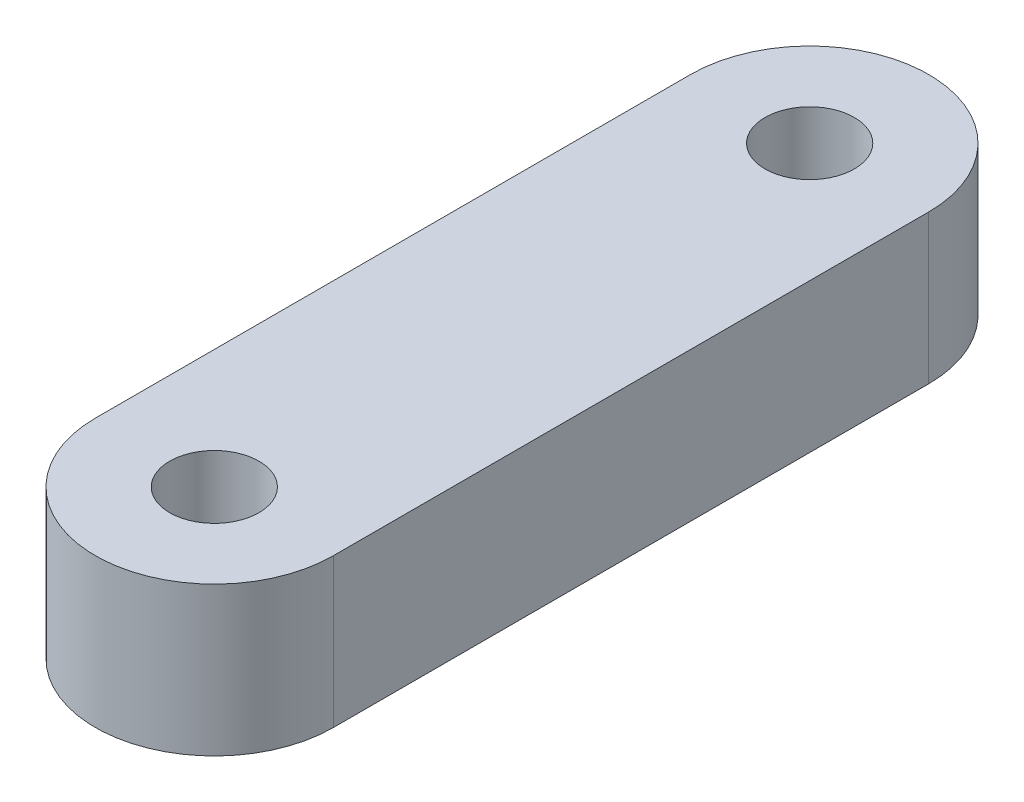
ISO-10303-21;
HEADER;
FILE_DESCRIPTION(('STEP AP214'),'2;1');
FILE_NAME('part.step','',(''),(''),'','','');
FILE_SCHEMA(('AUTOMOTIVE_DESIGN { 1 0 10303 214 1 1 1 1 }'));
ENDSEC;
DATA;
#1=APPLICATION_CONTEXT('core data for automotive mechanical design processes');
#2=APPLICATION_PROTOCOL_DEFINITION('international standard','automotive_design',2000,#1);
#3=PRODUCT_CONTEXT('',#1,'mechanical');
#4=PRODUCT('Part','Part','',(#3));
#5=PRODUCT_RELATED_PRODUCT_CATEGORY('part','',(#4));
#6=PRODUCT_DEFINITION_FORMATION('','',#4);
#7=PRODUCT_DEFINITION_CONTEXT('part definition',#1,'design');
#8=PRODUCT_DEFINITION('design','',#6,#7);
#9=PRODUCT_DEFINITION_SHAPE('','',#8);
#10=(LENGTH_UNIT() NAMED_UNIT(*) SI_UNIT(.MILLI.,.METRE.));
#11=(NAMED_UNIT(*) PLANE_ANGLE_UNIT() SI_UNIT($,.RADIAN.));
#12=(NAMED_UNIT(*) SI_UNIT($,.STERADIAN.) SOLID_ANGLE_UNIT());
#13=UNCERTAINTY_MEASURE_WITH_UNIT(LENGTH_MEASURE(1.E-05),#10,'distance_accuracy_value','');
#14=(GEOMETRIC_REPRESENTATION_CONTEXT(3) GLOBAL_UNCERTAINTY_ASSIGNED_CONTEXT((#13)) GLOBAL_UNIT_ASSIGNED_CONTEXT((#10,
#11,#12)) REPRESENTATION_CONTEXT('',''));
#15=CARTESIAN_POINT('',(0.,0.,0.));
#16=DIRECTION('',(0.,0.,1.));
#17=DIRECTION('',(1.,0.,0.));
#18=AXIS2_PLACEMENT_3D('',#15,#16,#17);
#19=CARTESIAN_POINT('',(-4.,5.,0.));
#20=DIRECTION('',(1.,0.,0.));
#21=DIRECTION('',(0.,0.,-1.));
#22=AXIS2_PLACEMENT_3D('',#19,#20,#21);
#23=PLANE('',#22);
#24=DIRECTION('',(0.,0.,1.));
#25=VECTOR('',#24,1.);
#26=CARTESIAN_POINT('',(-4.,0.,0.));
#27=LINE('',#26,#25);
#28=CARTESIAN_POINT('',(-4.,0.,-10.));
#29=VERTEX_POINT('',#28);
#30=CARTESIAN_POINT('',(-4.,0.,10.));
#31=VERTEX_POINT('',#30);
#32=EDGE_CURVE('E104',#29,#31,#27,.T.);
#33=ORIENTED_EDGE('',*,*,#32,.T.);
#34=DIRECTION('',(0.,-1.,0.));
#35=VECTOR('',#34,1.);
#36=CARTESIAN_POINT('',(-4.,5.,10.));
#37=LINE('',#36,#35);
#38=CARTESIAN_POINT('',(-4.,5.,10.));
#39=VERTEX_POINT('',#38);
#40=EDGE_CURVE('E11',#39,#31,#37,.T.);
#41=ORIENTED_EDGE('',*,*,#40,.F.);
#42=DIRECTION('',(0.,0.,1.));
#43=VECTOR('',#42,1.);
#44=CARTESIAN_POINT('',(-4.,5.,0.));
#45=LINE('',#44,#43);
#46=CARTESIAN_POINT('',(-4.,5.,-10.));
#47=VERTEX_POINT('',#46);
#48=EDGE_CURVE('E83',#47,#39,#45,.T.);
#49=ORIENTED_EDGE('',*,*,#48,.F.);
#50=DIRECTION('',(0.,-1.,0.));
#51=VECTOR('',#50,1.);
#52=CARTESIAN_POINT('',(-4.,5.,-10.));
#53=LINE('',#52,#51);
#54=EDGE_CURVE('E94',#47,#29,#53,.T.);
#55=ORIENTED_EDGE('',*,*,#54,.T.);
#56=EDGE_LOOP('',(#33,#41,#49,#55));
#57=FACE_BOUND('',#56,.T.);
#58=ADVANCED_FACE('F35',(#57),#23,.F.);
#59=CARTESIAN_POINT('',(0.,5.,10.));
#60=DIRECTION('',(0.,-1.,0.));
#61=DIRECTION('',(0.,0.,-1.));
#62=AXIS2_PLACEMENT_3D('',#59,#60,#61);
#63=CYLINDRICAL_SURFACE('',#62,4.);
#64=CARTESIAN_POINT('',(0.,0.,10.));
#65=DIRECTION('',(0.,1.,0.));
#66=DIRECTION('',(0.,0.,1.));
#67=AXIS2_PLACEMENT_3D('',#64,#65,#66);
#68=CIRCLE('',#67,4.);
#69=CARTESIAN_POINT('',(4.,0.,10.));
#70=VERTEX_POINT('',#69);
#71=EDGE_CURVE('E88',#31,#70,#68,.T.);
#72=ORIENTED_EDGE('',*,*,#71,.T.);
#73=DIRECTION('',(0.,-1.,0.));
#74=VECTOR('',#73,1.);
#75=CARTESIAN_POINT('',(4.,5.,10.));
#76=LINE('',#75,#74);
#77=CARTESIAN_POINT('',(4.,5.,10.));
#78=VERTEX_POINT('',#77);
#79=EDGE_CURVE('E44',#78,#70,#76,.T.);
#80=ORIENTED_EDGE('',*,*,#79,.F.);
#81=CARTESIAN_POINT('',(0.,5.,10.));
#82=DIRECTION('',(0.,1.,0.));
#83=DIRECTION('',(0.,0.,1.));
#84=AXIS2_PLACEMENT_3D('',#81,#82,#83);
#85=CIRCLE('',#84,4.);
#86=EDGE_CURVE('E78',#39,#78,#85,.T.);
#87=ORIENTED_EDGE('',*,*,#86,.F.);
#88=ORIENTED_EDGE('',*,*,#40,.T.);
#89=EDGE_LOOP('',(#72,#80,#87,#88));
#90=FACE_BOUND('',#89,.T.);
#91=ADVANCED_FACE('F87',(#90),#63,.T.);
#92=CARTESIAN_POINT('',(4.,5.,0.));
#93=DIRECTION('',(1.,0.,0.));
#94=DIRECTION('',(0.,0.,-1.));
#95=AXIS2_PLACEMENT_3D('',#92,#93,#94);
#96=PLANE('',#95);
#97=DIRECTION('',(0.,0.,1.));
#98=VECTOR('',#97,1.);
#99=CARTESIAN_POINT('',(4.,0.,0.));
#100=LINE('',#99,#98);
#101=CARTESIAN_POINT('',(4.,0.,-10.));
#102=VERTEX_POINT('',#101);
#103=EDGE_CURVE('E108',#102,#70,#100,.T.);
#104=ORIENTED_EDGE('',*,*,#103,.F.);
#105=DIRECTION('',(0.,-1.,0.));
#106=VECTOR('',#105,1.);
#107=CARTESIAN_POINT('',(4.,5.,-10.));
#108=LINE('',#107,#106);
#109=CARTESIAN_POINT('',(4.,5.,-10.));
#110=VERTEX_POINT('',#109);
#111=EDGE_CURVE('E68',#110,#102,#108,.T.);
#112=ORIENTED_EDGE('',*,*,#111,.F.);
#113=DIRECTION('',(0.,0.,1.));
#114=VECTOR('',#113,1.);
#115=CARTESIAN_POINT('',(4.,5.,0.));
#116=LINE('',#115,#114);
#117=EDGE_CURVE('E81',#110,#78,#116,.T.);
#118=ORIENTED_EDGE('',*,*,#117,.T.);
#119=ORIENTED_EDGE('',*,*,#79,.T.);
#120=EDGE_LOOP('',(#104,#112,#118,#119));
#121=FACE_BOUND('',#120,.T.);
#122=ADVANCED_FACE('F92',(#121),#96,.T.);
#123=CARTESIAN_POINT('',(0.,5.,-10.));
#124=DIRECTION('',(0.,-1.,0.));
#125=DIRECTION('',(0.,0.,-1.));
#126=AXIS2_PLACEMENT_3D('',#123,#124,#125);
#127=CYLINDRICAL_SURFACE('',#126,1.5);
#128=CARTESIAN_POINT('',(0.,5.,-10.));
#129=DIRECTION('',(0.,1.,0.));
#130=DIRECTION('',(0.,0.,1.));
#131=AXIS2_PLACEMENT_3D('',#128,#129,#130);
#132=CIRCLE('',#131,1.5);
#133=CARTESIAN_POINT('',(0.,5.,-8.5));
#134=VERTEX_POINT('',#133);
#135=EDGE_CURVE('E146',#134,#134,#132,.T.);
#136=ORIENTED_EDGE('',*,*,#135,.T.);
#137=EDGE_LOOP('',(#136));
#138=FACE_BOUND('',#137,.T.);
#139=CARTESIAN_POINT('',(0.,0.,-10.));
#140=DIRECTION('',(0.,1.,0.));
#141=DIRECTION('',(0.,0.,1.));
#142=AXIS2_PLACEMENT_3D('',#139,#140,#141);
#143=CIRCLE('',#142,1.5);
#144=CARTESIAN_POINT('',(0.,0.,-8.5));
#145=VERTEX_POINT('',#144);
#146=EDGE_CURVE('E101',#145,#145,#143,.T.);
#147=ORIENTED_EDGE('',*,*,#146,.F.);
#148=EDGE_LOOP('',(#147));
#149=FACE_BOUND('',#148,.T.);
#150=ADVANCED_FACE('F135',(#138,#149),#127,.F.);
#151=CARTESIAN_POINT('',(0.,5.,10.));
#152=DIRECTION('',(0.,-1.,0.));
#153=DIRECTION('',(0.,0.,-1.));
#154=AXIS2_PLACEMENT_3D('',#151,#152,#153);
#155=CYLINDRICAL_SURFACE('',#154,1.5);
#156=CARTESIAN_POINT('',(0.,5.,10.));
#157=DIRECTION('',(0.,1.,0.));
#158=DIRECTION('',(0.,0.,1.));
#159=AXIS2_PLACEMENT_3D('',#156,#157,#158);
#160=CIRCLE('',#159,1.5);
#161=CARTESIAN_POINT('',(0.,5.,11.5));
#162=VERTEX_POINT('',#161);
#163=EDGE_CURVE('E111',#162,#162,#160,.T.);
#164=ORIENTED_EDGE('',*,*,#163,.T.);
#165=EDGE_LOOP('',(#164));
#166=FACE_BOUND('',#165,.T.);
#167=CARTESIAN_POINT('',(0.,0.,10.));
#168=DIRECTION('',(0.,1.,0.));
#169=DIRECTION('',(0.,0.,1.));
#170=AXIS2_PLACEMENT_3D('',#167,#168,#169);
#171=CIRCLE('',#170,1.5);
#172=CARTESIAN_POINT('',(0.,0.,11.5));
#173=VERTEX_POINT('',#172);
#174=EDGE_CURVE('E98',#173,#173,#171,.T.);
#175=ORIENTED_EDGE('',*,*,#174,.F.);
#176=EDGE_LOOP('',(#175));
#177=FACE_BOUND('',#176,.T.);
#178=ADVANCED_FACE('F37',(#166,#177),#155,.F.);
#179=CARTESIAN_POINT('',(0.,5.,-10.));
#180=DIRECTION('',(0.,-1.,0.));
#181=DIRECTION('',(0.,0.,-1.));
#182=AXIS2_PLACEMENT_3D('',#179,#180,#181);
#183=CYLINDRICAL_SURFACE('',#182,4.);
#184=CARTESIAN_POINT('',(0.,0.,-10.));
#185=DIRECTION('',(0.,1.,0.));
#186=DIRECTION('',(0.,0.,1.));
#187=AXIS2_PLACEMENT_3D('',#184,#185,#186);
#188=CIRCLE('',#187,4.);
#189=EDGE_CURVE('E71',#102,#29,#188,.T.);
#190=ORIENTED_EDGE('',*,*,#189,.T.);
#191=ORIENTED_EDGE('',*,*,#54,.F.);
#192=CARTESIAN_POINT('',(0.,5.,-10.));
#193=DIRECTION('',(0.,1.,0.));
#194=DIRECTION('',(0.,0.,1.));
#195=AXIS2_PLACEMENT_3D('',#192,#193,#194);
#196=CIRCLE('',#195,4.);
#197=EDGE_CURVE('E52',#110,#47,#196,.T.);
#198=ORIENTED_EDGE('',*,*,#197,.F.);
#199=ORIENTED_EDGE('',*,*,#111,.T.);
#200=EDGE_LOOP('',(#190,#191,#198,#199));
#201=FACE_BOUND('',#200,.T.);
#202=ADVANCED_FACE('F123',(#201),#183,.T.);
#203=CARTESIAN_POINT('',(0.,5.,0.));
#204=DIRECTION('',(0.,1.,0.));
#205=DIRECTION('',(0.,0.,1.));
#206=AXIS2_PLACEMENT_3D('',#203,#204,#205);
#207=PLANE('',#206);
#208=ORIENTED_EDGE('',*,*,#163,.F.);
#209=EDGE_LOOP('',(#208));
#210=FACE_BOUND('',#209,.T.);
#211=ORIENTED_EDGE('',*,*,#135,.F.);
#212=EDGE_LOOP('',(#211));
#213=FACE_BOUND('',#212,.T.);
#214=ORIENTED_EDGE('',*,*,#48,.T.);
#215=ORIENTED_EDGE('',*,*,#86,.T.);
#216=ORIENTED_EDGE('',*,*,#117,.F.);
#217=ORIENTED_EDGE('',*,*,#197,.T.);
#218=EDGE_LOOP('',(#214,#215,#216,#217));
#219=FACE_BOUND('',#218,.T.);
#220=ADVANCED_FACE('F79',(#210,#213,#219),#207,.T.);
#221=CARTESIAN_POINT('',(0.,0.,0.));
#222=DIRECTION('',(0.,1.,0.));
#223=DIRECTION('',(0.,0.,1.));
#224=AXIS2_PLACEMENT_3D('',#221,#222,#223);
#225=PLANE('',#224);
#226=ORIENTED_EDGE('',*,*,#174,.T.);
#227=EDGE_LOOP('',(#226));
#228=FACE_BOUND('',#227,.T.);
#229=ORIENTED_EDGE('',*,*,#146,.T.);
#230=EDGE_LOOP('',(#229));
#231=FACE_BOUND('',#230,.T.);
#232=ORIENTED_EDGE('',*,*,#32,.F.);
#233=ORIENTED_EDGE('',*,*,#189,.F.);
#234=ORIENTED_EDGE('',*,*,#103,.T.);
#235=ORIENTED_EDGE('',*,*,#71,.F.);
#236=EDGE_LOOP('',(#232,#233,#234,#235));
#237=FACE_BOUND('',#236,.T.);
#238=ADVANCED_FACE('F116',(#228,#231,#237),#225,.F.);
#239=CLOSED_SHELL('',(#58,#91,#122,#150,#178,#202,#220,#238));
#240=MANIFOLD_SOLID_BREP('B2',#239);
#241=ADVANCED_BREP_SHAPE_REPRESENTATION('',(#18,#240),#14);
#242=SHAPE_DEFINITION_REPRESENTATION(#9,#241);
ENDSEC;
END-ISO-10303-21;
